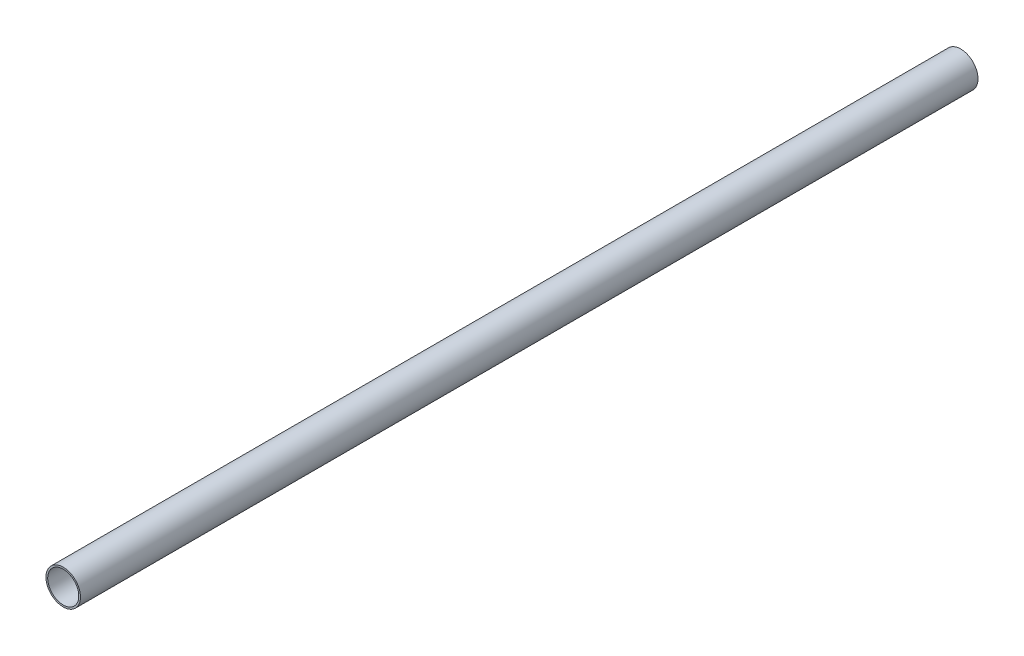
ISO-10303-21;
HEADER;
FILE_DESCRIPTION(('STEP AP214'),'2;1');
FILE_NAME('part.step','',(''),(''),'','','');
FILE_SCHEMA(('AUTOMOTIVE_DESIGN { 1 0 10303 214 1 1 1 1 }'));
ENDSEC;
DATA;
#1=APPLICATION_CONTEXT('core data for automotive mechanical design processes');
#2=APPLICATION_PROTOCOL_DEFINITION('international standard','automotive_design',2000,#1);
#3=PRODUCT_CONTEXT('',#1,'mechanical');
#4=PRODUCT('Part','Part','',(#3));
#5=PRODUCT_RELATED_PRODUCT_CATEGORY('part','',(#4));
#6=PRODUCT_DEFINITION_FORMATION('','',#4);
#7=PRODUCT_DEFINITION_CONTEXT('part definition',#1,'design');
#8=PRODUCT_DEFINITION('design','',#6,#7);
#9=PRODUCT_DEFINITION_SHAPE('','',#8);
#10=(LENGTH_UNIT() NAMED_UNIT(*) SI_UNIT(.MILLI.,.METRE.));
#11=(NAMED_UNIT(*) PLANE_ANGLE_UNIT() SI_UNIT($,.RADIAN.));
#12=(NAMED_UNIT(*) SI_UNIT($,.STERADIAN.) SOLID_ANGLE_UNIT());
#13=UNCERTAINTY_MEASURE_WITH_UNIT(LENGTH_MEASURE(1.E-05),#10,'distance_accuracy_value','');
#14=(GEOMETRIC_REPRESENTATION_CONTEXT(3) GLOBAL_UNCERTAINTY_ASSIGNED_CONTEXT((#13)) GLOBAL_UNIT_ASSIGNED_CONTEXT((#10,
#11,#12)) REPRESENTATION_CONTEXT('',''));
#15=CARTESIAN_POINT('',(0.,0.,0.));
#16=DIRECTION('',(0.,0.,1.));
#17=DIRECTION('',(1.,0.,0.));
#18=AXIS2_PLACEMENT_3D('',#15,#16,#17);
#19=CARTESIAN_POINT('',(0.,0.,520.));
#20=DIRECTION('',(0.,0.,1.));
#21=DIRECTION('',(1.,0.,0.));
#22=AXIS2_PLACEMENT_3D('',#19,#20,#21);
#23=PLANE('',#22);
#24=CARTESIAN_POINT('',(0.,0.,520.));
#25=DIRECTION('',(0.,0.,1.));
#26=DIRECTION('',(1.,0.,0.));
#27=AXIS2_PLACEMENT_3D('',#24,#25,#26);
#28=CIRCLE('',#27,10.);
#29=CARTESIAN_POINT('',(10.,0.,520.));
#30=VERTEX_POINT('',#29);
#31=EDGE_CURVE('E10',#30,#30,#28,.T.);
#32=ORIENTED_EDGE('',*,*,#31,.T.);
#33=EDGE_LOOP('',(#32));
#34=FACE_BOUND('',#33,.T.);
#35=CARTESIAN_POINT('',(0.,0.,520.));
#36=DIRECTION('',(0.,0.,1.));
#37=DIRECTION('',(1.,0.,0.));
#38=AXIS2_PLACEMENT_3D('',#35,#36,#37);
#39=CIRCLE('',#38,9.);
#40=CARTESIAN_POINT('',(9.,0.,520.));
#41=VERTEX_POINT('',#40);
#42=EDGE_CURVE('E52',#41,#41,#39,.T.);
#43=ORIENTED_EDGE('',*,*,#42,.F.);
#44=EDGE_LOOP('',(#43));
#45=FACE_BOUND('',#44,.T.);
#46=ADVANCED_FACE('F41',(#34,#45),#23,.T.);
#47=CARTESIAN_POINT('',(0.,0.,0.));
#48=DIRECTION('',(0.,0.,1.));
#49=DIRECTION('',(1.,0.,0.));
#50=AXIS2_PLACEMENT_3D('',#47,#48,#49);
#51=PLANE('',#50);
#52=CARTESIAN_POINT('',(0.,0.,0.));
#53=DIRECTION('',(0.,0.,1.));
#54=DIRECTION('',(1.,0.,0.));
#55=AXIS2_PLACEMENT_3D('',#52,#53,#54);
#56=CIRCLE('',#55,10.);
#57=CARTESIAN_POINT('',(10.,0.,0.));
#58=VERTEX_POINT('',#57);
#59=EDGE_CURVE('E45',#58,#58,#56,.T.);
#60=ORIENTED_EDGE('',*,*,#59,.F.);
#61=EDGE_LOOP('',(#60));
#62=FACE_BOUND('',#61,.T.);
#63=CARTESIAN_POINT('',(0.,0.,0.));
#64=DIRECTION('',(0.,0.,1.));
#65=DIRECTION('',(1.,0.,0.));
#66=AXIS2_PLACEMENT_3D('',#63,#64,#65);
#67=CIRCLE('',#66,9.);
#68=CARTESIAN_POINT('',(9.,0.,0.));
#69=VERTEX_POINT('',#68);
#70=EDGE_CURVE('E54',#69,#69,#67,.T.);
#71=ORIENTED_EDGE('',*,*,#70,.T.);
#72=EDGE_LOOP('',(#71));
#73=FACE_BOUND('',#72,.T.);
#74=ADVANCED_FACE('F64',(#62,#73),#51,.F.);
#75=CARTESIAN_POINT('',(0.,0.,520.));
#76=DIRECTION('',(0.,0.,-1.));
#77=DIRECTION('',(-1.,0.,0.));
#78=AXIS2_PLACEMENT_3D('',#75,#76,#77);
#79=CYLINDRICAL_SURFACE('',#78,10.);
#80=ORIENTED_EDGE('',*,*,#31,.F.);
#81=EDGE_LOOP('',(#80));
#82=FACE_BOUND('',#81,.T.);
#83=ORIENTED_EDGE('',*,*,#59,.T.);
#84=EDGE_LOOP('',(#83));
#85=FACE_BOUND('',#84,.T.);
#86=ADVANCED_FACE('F43',(#82,#85),#79,.T.);
#87=CARTESIAN_POINT('',(0.,0.,520.));
#88=DIRECTION('',(0.,0.,-1.));
#89=DIRECTION('',(-1.,0.,0.));
#90=AXIS2_PLACEMENT_3D('',#87,#88,#89);
#91=CYLINDRICAL_SURFACE('',#90,9.);
#92=ORIENTED_EDGE('',*,*,#42,.T.);
#93=EDGE_LOOP('',(#92));
#94=FACE_BOUND('',#93,.T.);
#95=ORIENTED_EDGE('',*,*,#70,.F.);
#96=EDGE_LOOP('',(#95));
#97=FACE_BOUND('',#96,.T.);
#98=ADVANCED_FACE('F60',(#94,#97),#91,.F.);
#99=CLOSED_SHELL('',(#46,#74,#86,#98));
#100=MANIFOLD_SOLID_BREP('B2',#99);
#101=ADVANCED_BREP_SHAPE_REPRESENTATION('',(#18,#100),#14);
#102=SHAPE_DEFINITION_REPRESENTATION(#9,#101);
ENDSEC;
END-ISO-10303-21;
